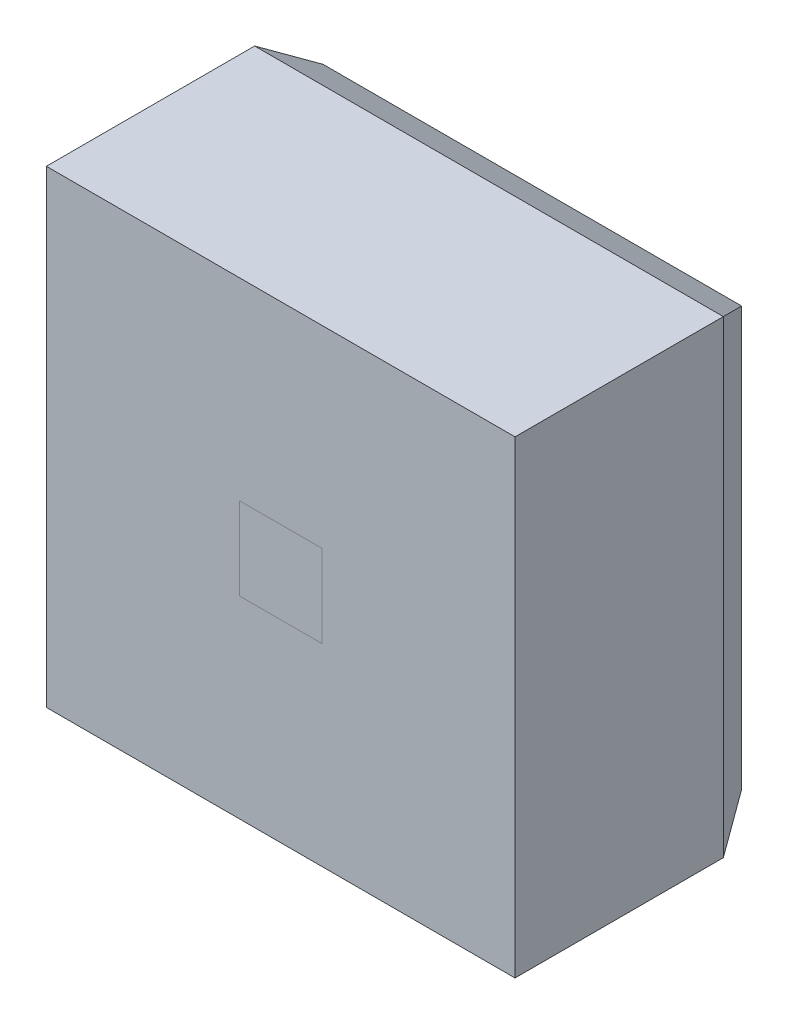
ISO-10303-21;
HEADER;
FILE_DESCRIPTION(('STEP AP214'),'2;1');
FILE_NAME('part.step','',(''),(''),'','','');
FILE_SCHEMA(('AUTOMOTIVE_DESIGN { 1 0 10303 214 1 1 1 1 }'));
ENDSEC;
DATA;
#1=APPLICATION_CONTEXT('core data for automotive mechanical design processes');
#2=APPLICATION_PROTOCOL_DEFINITION('international standard','automotive_design',2000,#1);
#3=PRODUCT_CONTEXT('',#1,'mechanical');
#4=PRODUCT('Part','Part','',(#3));
#5=PRODUCT_RELATED_PRODUCT_CATEGORY('part','',(#4));
#6=PRODUCT_DEFINITION_FORMATION('','',#4);
#7=PRODUCT_DEFINITION_CONTEXT('part definition',#1,'design');
#8=PRODUCT_DEFINITION('design','',#6,#7);
#9=PRODUCT_DEFINITION_SHAPE('','',#8);
#10=(LENGTH_UNIT() NAMED_UNIT(*) SI_UNIT(.MILLI.,.METRE.));
#11=(NAMED_UNIT(*) PLANE_ANGLE_UNIT() SI_UNIT($,.RADIAN.));
#12=(NAMED_UNIT(*) SI_UNIT($,.STERADIAN.) SOLID_ANGLE_UNIT());
#13=UNCERTAINTY_MEASURE_WITH_UNIT(LENGTH_MEASURE(1.E-05),#10,'distance_accuracy_value','');
#14=(GEOMETRIC_REPRESENTATION_CONTEXT(3) GLOBAL_UNCERTAINTY_ASSIGNED_CONTEXT((#13)) GLOBAL_UNIT_ASSIGNED_CONTEXT((#10,
#11,#12)) REPRESENTATION_CONTEXT('',''));
#15=CARTESIAN_POINT('',(0.,0.,0.));
#16=DIRECTION('',(0.,0.,1.));
#17=DIRECTION('',(1.,0.,0.));
#18=AXIS2_PLACEMENT_3D('',#15,#16,#17);
#19=CARTESIAN_POINT('',(0.,0.,0.68));
#20=DIRECTION('',(0.,0.,1.));
#21=DIRECTION('',(1.,0.,0.));
#22=AXIS2_PLACEMENT_3D('',#19,#20,#21);
#23=PLANE('',#22);
#24=DIRECTION('',(0.,-1.,0.));
#25=VECTOR('',#24,1.);
#26=CARTESIAN_POINT('',(-0.54,0.54,0.68));
#27=LINE('',#26,#25);
#28=CARTESIAN_POINT('',(-0.54,0.54,0.68));
#29=VERTEX_POINT('',#28);
#30=CARTESIAN_POINT('',(-0.54,-0.54,0.68));
#31=VERTEX_POINT('',#30);
#32=EDGE_CURVE('E111',#29,#31,#27,.T.);
#33=ORIENTED_EDGE('',*,*,#32,.T.);
#34=DIRECTION('',(1.,0.,0.));
#35=VECTOR('',#34,1.);
#36=CARTESIAN_POINT('',(-0.54,-0.54,0.68));
#37=LINE('',#36,#35);
#38=CARTESIAN_POINT('',(0.54,-0.54,0.68));
#39=VERTEX_POINT('',#38);
#40=EDGE_CURVE('E99',#31,#39,#37,.T.);
#41=ORIENTED_EDGE('',*,*,#40,.T.);
#42=DIRECTION('',(0.,1.,0.));
#43=VECTOR('',#42,1.);
#44=CARTESIAN_POINT('',(0.54,0.54,0.68));
#45=LINE('',#44,#43);
#46=CARTESIAN_POINT('',(0.54,0.54,0.68));
#47=VERTEX_POINT('',#46);
#48=EDGE_CURVE('E110',#39,#47,#45,.T.);
#49=ORIENTED_EDGE('',*,*,#48,.T.);
#50=DIRECTION('',(-1.,0.,0.));
#51=VECTOR('',#50,1.);
#52=CARTESIAN_POINT('',(-0.54,0.54,0.68));
#53=LINE('',#52,#51);
#54=EDGE_CURVE('E116',#47,#29,#53,.T.);
#55=ORIENTED_EDGE('',*,*,#54,.T.);
#56=EDGE_LOOP('',(#33,#41,#49,#55));
#57=FACE_BOUND('',#56,.T.);
#58=DIRECTION('',(1.,0.,0.));
#59=VECTOR('',#58,1.);
#60=CARTESIAN_POINT('',(0.,0.095,0.68));
#61=LINE('',#60,#59);
#62=CARTESIAN_POINT('',(-0.095,0.095,0.68));
#63=VERTEX_POINT('',#62);
#64=CARTESIAN_POINT('',(0.095,0.095,0.68));
#65=VERTEX_POINT('',#64);
#66=EDGE_CURVE('E47',#63,#65,#61,.T.);
#67=ORIENTED_EDGE('',*,*,#66,.T.);
#68=DIRECTION('',(0.,-1.,0.));
#69=VECTOR('',#68,1.);
#70=CARTESIAN_POINT('',(0.095,0.,0.68));
#71=LINE('',#70,#69);
#72=CARTESIAN_POINT('',(0.095,-0.095,0.68));
#73=VERTEX_POINT('',#72);
#74=EDGE_CURVE('E12',#65,#73,#71,.T.);
#75=ORIENTED_EDGE('',*,*,#74,.T.);
#76=DIRECTION('',(-1.,0.,0.));
#77=VECTOR('',#76,1.);
#78=CARTESIAN_POINT('',(0.,-0.095,0.68));
#79=LINE('',#78,#77);
#80=CARTESIAN_POINT('',(-0.095,-0.095,0.68));
#81=VERTEX_POINT('',#80);
#82=EDGE_CURVE('E179',#73,#81,#79,.T.);
#83=ORIENTED_EDGE('',*,*,#82,.T.);
#84=DIRECTION('',(0.,1.,0.));
#85=VECTOR('',#84,1.);
#86=CARTESIAN_POINT('',(-0.095,0.,0.68));
#87=LINE('',#86,#85);
#88=EDGE_CURVE('E183',#81,#63,#87,.T.);
#89=ORIENTED_EDGE('',*,*,#88,.T.);
#90=EDGE_LOOP('',(#67,#75,#83,#89));
#91=FACE_BOUND('',#90,.T.);
#92=ADVANCED_FACE('F38',(#57,#91),#23,.T.);
#93=CARTESIAN_POINT('',(-0.54,0.54,0.68));
#94=DIRECTION('',(1.,0.,0.));
#95=DIRECTION('',(0.,1.,0.));
#96=AXIS2_PLACEMENT_3D('',#93,#94,#95);
#97=PLANE('',#96);
#98=DIRECTION('',(0.,0.,-1.));
#99=VECTOR('',#98,1.);
#100=CARTESIAN_POINT('',(-0.54,0.54,0.68));
#101=LINE('',#100,#99);
#102=CARTESIAN_POINT('',(-0.54,0.54,0.200000000000001));
#103=VERTEX_POINT('',#102);
#104=EDGE_CURVE('E268',#29,#103,#101,.T.);
#105=ORIENTED_EDGE('',*,*,#104,.T.);
#106=DIRECTION('',(0.,-1.,0.));
#107=VECTOR('',#106,1.);
#108=CARTESIAN_POINT('',(-0.54,0.54,0.200000000000001));
#109=LINE('',#108,#107);
#110=CARTESIAN_POINT('',(-0.54,-0.54,0.200000000000001));
#111=VERTEX_POINT('',#110);
#112=EDGE_CURVE('E124',#103,#111,#109,.T.);
#113=ORIENTED_EDGE('',*,*,#112,.T.);
#114=DIRECTION('',(0.,0.,-1.));
#115=VECTOR('',#114,1.);
#116=CARTESIAN_POINT('',(-0.54,-0.54,0.68));
#117=LINE('',#116,#115);
#118=EDGE_CURVE('E104',#31,#111,#117,.T.);
#119=ORIENTED_EDGE('',*,*,#118,.F.);
#120=ORIENTED_EDGE('',*,*,#32,.F.);
#121=EDGE_LOOP('',(#105,#113,#119,#120));
#122=FACE_BOUND('',#121,.T.);
#123=ADVANCED_FACE('F122',(#122),#97,.F.);
#124=CARTESIAN_POINT('',(-0.54,-0.54,0.68));
#125=DIRECTION('',(0.,1.,0.));
#126=DIRECTION('',(-1.,0.,0.));
#127=AXIS2_PLACEMENT_3D('',#124,#125,#126);
#128=PLANE('',#127);
#129=ORIENTED_EDGE('',*,*,#118,.T.);
#130=DIRECTION('',(1.,0.,0.));
#131=VECTOR('',#130,1.);
#132=CARTESIAN_POINT('',(-0.54,-0.54,0.200000000000001));
#133=LINE('',#132,#131);
#134=CARTESIAN_POINT('',(0.54,-0.54,0.200000000000001));
#135=VERTEX_POINT('',#134);
#136=EDGE_CURVE('E125',#111,#135,#133,.T.);
#137=ORIENTED_EDGE('',*,*,#136,.T.);
#138=DIRECTION('',(0.,0.,-1.));
#139=VECTOR('',#138,1.);
#140=CARTESIAN_POINT('',(0.54,-0.54,0.68));
#141=LINE('',#140,#139);
#142=EDGE_CURVE('E107',#39,#135,#141,.T.);
#143=ORIENTED_EDGE('',*,*,#142,.F.);
#144=ORIENTED_EDGE('',*,*,#40,.F.);
#145=EDGE_LOOP('',(#129,#137,#143,#144));
#146=FACE_BOUND('',#145,.T.);
#147=ADVANCED_FACE('F101',(#146),#128,.F.);
#148=CARTESIAN_POINT('',(0.54,0.54,0.68));
#149=DIRECTION('',(-1.,0.,0.));
#150=DIRECTION('',(0.,0.,1.));
#151=AXIS2_PLACEMENT_3D('',#148,#149,#150);
#152=PLANE('',#151);
#153=ORIENTED_EDGE('',*,*,#142,.T.);
#154=DIRECTION('',(0.,1.,0.));
#155=VECTOR('',#154,1.);
#156=CARTESIAN_POINT('',(0.54,0.54,0.200000000000001));
#157=LINE('',#156,#155);
#158=CARTESIAN_POINT('',(0.54,0.54,0.200000000000001));
#159=VERTEX_POINT('',#158);
#160=EDGE_CURVE('E141',#135,#159,#157,.T.);
#161=ORIENTED_EDGE('',*,*,#160,.T.);
#162=DIRECTION('',(0.,0.,-1.));
#163=VECTOR('',#162,1.);
#164=CARTESIAN_POINT('',(0.54,0.54,0.68));
#165=LINE('',#164,#163);
#166=EDGE_CURVE('E129',#47,#159,#165,.T.);
#167=ORIENTED_EDGE('',*,*,#166,.F.);
#168=ORIENTED_EDGE('',*,*,#48,.F.);
#169=EDGE_LOOP('',(#153,#161,#167,#168));
#170=FACE_BOUND('',#169,.T.);
#171=ADVANCED_FACE('F200',(#170),#152,.F.);
#172=CARTESIAN_POINT('',(-0.54,0.54,0.68));
#173=DIRECTION('',(0.,-1.,0.));
#174=DIRECTION('',(1.,0.,0.));
#175=AXIS2_PLACEMENT_3D('',#172,#173,#174);
#176=PLANE('',#175);
#177=ORIENTED_EDGE('',*,*,#166,.T.);
#178=DIRECTION('',(-1.,0.,0.));
#179=VECTOR('',#178,1.);
#180=CARTESIAN_POINT('',(-0.54,0.54,0.200000000000001));
#181=LINE('',#180,#179);
#182=EDGE_CURVE('E143',#159,#103,#181,.T.);
#183=ORIENTED_EDGE('',*,*,#182,.T.);
#184=ORIENTED_EDGE('',*,*,#104,.F.);
#185=ORIENTED_EDGE('',*,*,#54,.F.);
#186=EDGE_LOOP('',(#177,#183,#184,#185));
#187=FACE_BOUND('',#186,.T.);
#188=ADVANCED_FACE('F191',(#187),#176,.F.);
#189=ORIENTED_EDGE('',*,*,#74,.F.);
#190=ORIENTED_EDGE('',*,*,#66,.F.);
#191=ORIENTED_EDGE('',*,*,#88,.F.);
#192=ORIENTED_EDGE('',*,*,#82,.F.);
#193=EDGE_LOOP('',(#189,#190,#191,#192));
#194=FACE_BOUND('',#193,.T.);
#195=ADVANCED_FACE('F188',(#194),#23,.T.);
#196=CARTESIAN_POINT('',(0.,0.,0.1));
#197=DIRECTION('',(0.,0.,1.));
#198=DIRECTION('',(1.,0.,0.));
#199=AXIS2_PLACEMENT_3D('',#196,#197,#198);
#200=PLANE('',#199);
#201=CARTESIAN_POINT('',(-0.25,-0.25,0.1));
#202=DIRECTION('',(0.,0.,1.));
#203=DIRECTION('',(1.,0.,0.));
#204=AXIS2_PLACEMENT_3D('',#201,#202,#203);
#205=CIRCLE('',#204,0.125);
#206=CARTESIAN_POINT('',(-0.125,-0.25,0.1));
#207=VERTEX_POINT('',#206);
#208=EDGE_CURVE('E164',#207,#207,#205,.F.);
#209=ORIENTED_EDGE('',*,*,#208,.F.);
#210=EDGE_LOOP('',(#209));
#211=FACE_BOUND('',#210,.T.);
#212=CARTESIAN_POINT('',(0.25,0.25,0.1));
#213=DIRECTION('',(0.,0.,1.));
#214=DIRECTION('',(1.,0.,0.));
#215=AXIS2_PLACEMENT_3D('',#212,#213,#214);
#216=CIRCLE('',#215,0.125);
#217=CARTESIAN_POINT('',(0.375,0.25,0.1));
#218=VERTEX_POINT('',#217);
#219=EDGE_CURVE('E161',#218,#218,#216,.F.);
#220=ORIENTED_EDGE('',*,*,#219,.F.);
#221=EDGE_LOOP('',(#220));
#222=FACE_BOUND('',#221,.T.);
#223=CARTESIAN_POINT('',(0.25,-0.25,0.1));
#224=DIRECTION('',(0.,0.,1.));
#225=DIRECTION('',(1.,0.,0.));
#226=AXIS2_PLACEMENT_3D('',#223,#224,#225);
#227=CIRCLE('',#226,0.125);
#228=CARTESIAN_POINT('',(0.375,-0.25,0.1));
#229=VERTEX_POINT('',#228);
#230=EDGE_CURVE('E158',#229,#229,#227,.F.);
#231=ORIENTED_EDGE('',*,*,#230,.F.);
#232=EDGE_LOOP('',(#231));
#233=FACE_BOUND('',#232,.T.);
#234=CARTESIAN_POINT('',(-0.25,0.25,0.1));
#235=DIRECTION('',(0.,0.,1.));
#236=DIRECTION('',(1.,0.,0.));
#237=AXIS2_PLACEMENT_3D('',#234,#235,#236);
#238=CIRCLE('',#237,0.125);
#239=CARTESIAN_POINT('',(-0.125,0.25,0.1));
#240=VERTEX_POINT('',#239);
#241=EDGE_CURVE('E146',#240,#240,#238,.F.);
#242=ORIENTED_EDGE('',*,*,#241,.F.);
#243=EDGE_LOOP('',(#242));
#244=FACE_BOUND('',#243,.T.);
#245=DIRECTION('',(0.,-1.,0.));
#246=VECTOR('',#245,1.);
#247=CARTESIAN_POINT('',(0.482264973081037,0.,0.1));
#248=LINE('',#247,#246);
#249=CARTESIAN_POINT('',(0.482264973081037,0.482264973081038,0.1));
#250=VERTEX_POINT('',#249);
#251=CARTESIAN_POINT('',(0.482264973081037,-0.482264973081038,0.1));
#252=VERTEX_POINT('',#251);
#253=EDGE_CURVE('E136',#250,#252,#248,.T.);
#254=ORIENTED_EDGE('',*,*,#253,.T.);
#255=DIRECTION('',(-1.,0.,0.));
#256=VECTOR('',#255,1.);
#257=CARTESIAN_POINT('',(0.,-0.482264973081038,0.1));
#258=LINE('',#257,#256);
#259=CARTESIAN_POINT('',(-0.482264973081038,-0.482264973081037,0.1));
#260=VERTEX_POINT('',#259);
#261=EDGE_CURVE('E138',#252,#260,#258,.T.);
#262=ORIENTED_EDGE('',*,*,#261,.T.);
#263=DIRECTION('',(0.,1.,0.));
#264=VECTOR('',#263,1.);
#265=CARTESIAN_POINT('',(-0.482264973081038,0.,0.1));
#266=LINE('',#265,#264);
#267=CARTESIAN_POINT('',(-0.482264973081037,0.482264973081037,0.1));
#268=VERTEX_POINT('',#267);
#269=EDGE_CURVE('E127',#260,#268,#266,.T.);
#270=ORIENTED_EDGE('',*,*,#269,.T.);
#271=DIRECTION('',(1.,0.,0.));
#272=VECTOR('',#271,1.);
#273=CARTESIAN_POINT('',(0.,0.482264973081038,0.1));
#274=LINE('',#273,#272);
#275=EDGE_CURVE('E134',#268,#250,#274,.T.);
#276=ORIENTED_EDGE('',*,*,#275,.T.);
#277=EDGE_LOOP('',(#254,#262,#270,#276));
#278=FACE_BOUND('',#277,.T.);
#279=ADVANCED_FACE('F190',(#211,#222,#233,#244,#278),#200,.F.);
#280=CARTESIAN_POINT('',(-0.54,0.54,0.200000000000001));
#281=DIRECTION('',(0.,-0.86602540378444,0.499999999999998));
#282=DIRECTION('',(-1.,0.,0.));
#283=AXIS2_PLACEMENT_3D('',#280,#281,#282);
#284=PLANE('',#283);
#285=DIRECTION('',(-0.447213595499956,-0.447213595499957,-0.774596669241485));
#286=VECTOR('',#285,1.);
#287=CARTESIAN_POINT('',(0.324000000000001,0.324000000000002,-0.174122974434876));
#288=LINE('',#287,#286);
#289=EDGE_CURVE('E151',#250,#159,#288,.F.);
#290=ORIENTED_EDGE('',*,*,#289,.F.);
#291=ORIENTED_EDGE('',*,*,#275,.F.);
#292=DIRECTION('',(0.447213595499956,-0.447213595499956,-0.774596669241485));
#293=VECTOR('',#292,1.);
#294=CARTESIAN_POINT('',(-0.54,0.54,0.200000000000001));
#295=LINE('',#294,#293);
#296=EDGE_CURVE('E120',#103,#268,#295,.T.);
#297=ORIENTED_EDGE('',*,*,#296,.F.);
#298=ORIENTED_EDGE('',*,*,#182,.F.);
#299=EDGE_LOOP('',(#290,#291,#297,#298));
#300=FACE_BOUND('',#299,.T.);
#301=ADVANCED_FACE('F197',(#300),#284,.F.);
#302=CARTESIAN_POINT('',(-0.54,0.54,0.200000000000001));
#303=DIRECTION('',(0.86602540378444,0.,0.499999999999998));
#304=DIRECTION('',(0.,-1.,0.));
#305=AXIS2_PLACEMENT_3D('',#302,#303,#304);
#306=PLANE('',#305);
#307=ORIENTED_EDGE('',*,*,#296,.T.);
#308=ORIENTED_EDGE('',*,*,#269,.F.);
#309=DIRECTION('',(-0.447213595499957,-0.447213595499956,0.774596669241485));
#310=VECTOR('',#309,1.);
#311=CARTESIAN_POINT('',(-0.324000000000002,-0.324000000000001,-0.174122974434876));
#312=LINE('',#311,#310);
#313=EDGE_CURVE('E149',#111,#260,#312,.F.);
#314=ORIENTED_EDGE('',*,*,#313,.F.);
#315=ORIENTED_EDGE('',*,*,#112,.F.);
#316=EDGE_LOOP('',(#307,#308,#314,#315));
#317=FACE_BOUND('',#316,.T.);
#318=ADVANCED_FACE('F223',(#317),#306,.F.);
#319=CARTESIAN_POINT('',(0.54,0.54,0.200000000000001));
#320=DIRECTION('',(-0.86602540378444,0.,0.499999999999998));
#321=DIRECTION('',(0.,1.,0.));
#322=AXIS2_PLACEMENT_3D('',#319,#320,#321);
#323=PLANE('',#322);
#324=ORIENTED_EDGE('',*,*,#289,.T.);
#325=ORIENTED_EDGE('',*,*,#160,.F.);
#326=DIRECTION('',(-0.447213595499956,0.447213595499957,-0.774596669241485));
#327=VECTOR('',#326,1.);
#328=CARTESIAN_POINT('',(0.324000000000001,-0.324000000000001,-0.174122974434877));
#329=LINE('',#328,#327);
#330=EDGE_CURVE('E147',#252,#135,#329,.F.);
#331=ORIENTED_EDGE('',*,*,#330,.F.);
#332=ORIENTED_EDGE('',*,*,#253,.F.);
#333=EDGE_LOOP('',(#324,#325,#331,#332));
#334=FACE_BOUND('',#333,.T.);
#335=ADVANCED_FACE('F219',(#334),#323,.F.);
#336=CARTESIAN_POINT('',(-0.54,-0.54,0.200000000000001));
#337=DIRECTION('',(0.,0.86602540378444,0.499999999999998));
#338=DIRECTION('',(1.,0.,0.));
#339=AXIS2_PLACEMENT_3D('',#336,#337,#338);
#340=PLANE('',#339);
#341=ORIENTED_EDGE('',*,*,#313,.T.);
#342=ORIENTED_EDGE('',*,*,#261,.F.);
#343=ORIENTED_EDGE('',*,*,#330,.T.);
#344=ORIENTED_EDGE('',*,*,#136,.F.);
#345=EDGE_LOOP('',(#341,#342,#343,#344));
#346=FACE_BOUND('',#345,.T.);
#347=ADVANCED_FACE('F215',(#346),#340,.F.);
#348=CARTESIAN_POINT('',(-0.25,0.25,0.));
#349=DIRECTION('',(0.,0.,1.));
#350=DIRECTION('',(1.,0.,0.));
#351=AXIS2_PLACEMENT_3D('',#348,#349,#350);
#352=PLANE('',#351);
#353=CARTESIAN_POINT('',(-0.25,0.25,0.));
#354=DIRECTION('',(0.,0.,1.));
#355=DIRECTION('',(1.,0.,0.));
#356=AXIS2_PLACEMENT_3D('',#353,#354,#355);
#357=CIRCLE('',#356,0.00252551286084111);
#358=CARTESIAN_POINT('',(-0.247474487139159,0.25,0.));
#359=VERTEX_POINT('',#358);
#360=EDGE_CURVE('E176',#359,#359,#357,.F.);
#361=ORIENTED_EDGE('',*,*,#360,.T.);
#362=EDGE_LOOP('',(#361));
#363=FACE_BOUND('',#362,.T.);
#364=ADVANCED_FACE('F218',(#363),#352,.F.);
#365=CARTESIAN_POINT('',(0.25,-0.25,0.));
#366=DIRECTION('',(0.,0.,-1.));
#367=DIRECTION('',(-1.,0.,0.));
#368=AXIS2_PLACEMENT_3D('',#365,#366,#367);
#369=PLANE('',#368);
#370=CARTESIAN_POINT('',(0.25,-0.25,0.));
#371=DIRECTION('',(0.,0.,-1.));
#372=DIRECTION('',(-1.,0.,0.));
#373=AXIS2_PLACEMENT_3D('',#370,#371,#372);
#374=CIRCLE('',#373,0.002525512860841);
#375=CARTESIAN_POINT('',(0.247474487139159,-0.25,0.));
#376=VERTEX_POINT('',#375);
#377=EDGE_CURVE('E170',#376,#376,#374,.T.);
#378=ORIENTED_EDGE('',*,*,#377,.T.);
#379=EDGE_LOOP('',(#378));
#380=FACE_BOUND('',#379,.T.);
#381=ADVANCED_FACE('F321',(#380),#369,.T.);
#382=CARTESIAN_POINT('',(0.25,0.25,0.));
#383=DIRECTION('',(0.,0.,1.));
#384=DIRECTION('',(1.,0.,0.));
#385=AXIS2_PLACEMENT_3D('',#382,#383,#384);
#386=PLANE('',#385);
#387=CARTESIAN_POINT('',(0.25,0.25,0.));
#388=DIRECTION('',(0.,0.,1.));
#389=DIRECTION('',(1.,0.,0.));
#390=AXIS2_PLACEMENT_3D('',#387,#388,#389);
#391=CIRCLE('',#390,0.00252551286084111);
#392=CARTESIAN_POINT('',(0.252525512860841,0.25,0.));
#393=VERTEX_POINT('',#392);
#394=EDGE_CURVE('E167',#393,#393,#391,.F.);
#395=ORIENTED_EDGE('',*,*,#394,.T.);
#396=EDGE_LOOP('',(#395));
#397=FACE_BOUND('',#396,.T.);
#398=ADVANCED_FACE('F330',(#397),#386,.F.);
#399=CARTESIAN_POINT('',(-0.25,-0.25,0.));
#400=DIRECTION('',(0.,0.,-1.));
#401=DIRECTION('',(-1.,0.,0.));
#402=AXIS2_PLACEMENT_3D('',#399,#400,#401);
#403=PLANE('',#402);
#404=CARTESIAN_POINT('',(-0.25,-0.25,0.));
#405=DIRECTION('',(0.,0.,-1.));
#406=DIRECTION('',(-1.,0.,0.));
#407=AXIS2_PLACEMENT_3D('',#404,#405,#406);
#408=CIRCLE('',#407,0.002525512860841);
#409=CARTESIAN_POINT('',(-0.252525512860841,-0.25,0.));
#410=VERTEX_POINT('',#409);
#411=EDGE_CURVE('E173',#410,#410,#408,.T.);
#412=ORIENTED_EDGE('',*,*,#411,.T.);
#413=EDGE_LOOP('',(#412));
#414=FACE_BOUND('',#413,.T.);
#415=ADVANCED_FACE('F235',(#414),#403,.T.);
#416=CARTESIAN_POINT('',(0.25,0.25,0.125));
#417=DIRECTION('',(0.,0.,-1.));
#418=DIRECTION('',(-1.,0.,0.));
#419=AXIS2_PLACEMENT_3D('',#416,#417,#418);
#420=DEGENERATE_TOROIDAL_SURFACE('',#419,0.00252551286084111,0.125,.T.);
#421=ORIENTED_EDGE('',*,*,#394,.F.);
#422=EDGE_LOOP('',(#421));
#423=FACE_BOUND('',#422,.T.);
#424=ORIENTED_EDGE('',*,*,#219,.T.);
#425=EDGE_LOOP('',(#424));
#426=FACE_BOUND('',#425,.T.);
#427=ADVANCED_FACE('F231',(#423,#426),#420,.T.);
#428=CARTESIAN_POINT('',(0.25,-0.25,0.125));
#429=DIRECTION('',(0.,0.,1.));
#430=DIRECTION('',(1.,0.,0.));
#431=AXIS2_PLACEMENT_3D('',#428,#429,#430);
#432=DEGENERATE_TOROIDAL_SURFACE('',#431,0.002525512860841,0.125,.T.);
#433=ORIENTED_EDGE('',*,*,#377,.F.);
#434=EDGE_LOOP('',(#433));
#435=FACE_BOUND('',#434,.T.);
#436=ORIENTED_EDGE('',*,*,#230,.T.);
#437=EDGE_LOOP('',(#436));
#438=FACE_BOUND('',#437,.T.);
#439=ADVANCED_FACE('F234',(#435,#438),#432,.T.);
#440=CARTESIAN_POINT('',(-0.25,-0.25,0.125));
#441=DIRECTION('',(0.,0.,1.));
#442=DIRECTION('',(1.,0.,0.));
#443=AXIS2_PLACEMENT_3D('',#440,#441,#442);
#444=DEGENERATE_TOROIDAL_SURFACE('',#443,0.002525512860841,0.125,.T.);
#445=ORIENTED_EDGE('',*,*,#411,.F.);
#446=EDGE_LOOP('',(#445));
#447=FACE_BOUND('',#446,.T.);
#448=ORIENTED_EDGE('',*,*,#208,.T.);
#449=EDGE_LOOP('',(#448));
#450=FACE_BOUND('',#449,.T.);
#451=ADVANCED_FACE('F238',(#447,#450),#444,.T.);
#452=CARTESIAN_POINT('',(-0.25,0.25,0.125));
#453=DIRECTION('',(0.,0.,-1.));
#454=DIRECTION('',(-1.,0.,0.));
#455=AXIS2_PLACEMENT_3D('',#452,#453,#454);
#456=DEGENERATE_TOROIDAL_SURFACE('',#455,0.00252551286084111,0.125,.T.);
#457=ORIENTED_EDGE('',*,*,#360,.F.);
#458=EDGE_LOOP('',(#457));
#459=FACE_BOUND('',#458,.T.);
#460=ORIENTED_EDGE('',*,*,#241,.T.);
#461=EDGE_LOOP('',(#460));
#462=FACE_BOUND('',#461,.T.);
#463=ADVANCED_FACE('F40',(#459,#462),#456,.T.);
#464=CLOSED_SHELL('',(#92,#123,#147,#171,#188,#195,#279,#301,#318,#335,#347,#364,#381,#398,#415,
#427,#439,#451,#463));
#465=MANIFOLD_SOLID_BREP('B2',#464);
#466=ADVANCED_BREP_SHAPE_REPRESENTATION('',(#18,#465),#14);
#467=SHAPE_DEFINITION_REPRESENTATION(#9,#466);
ENDSEC;
END-ISO-10303-21;
